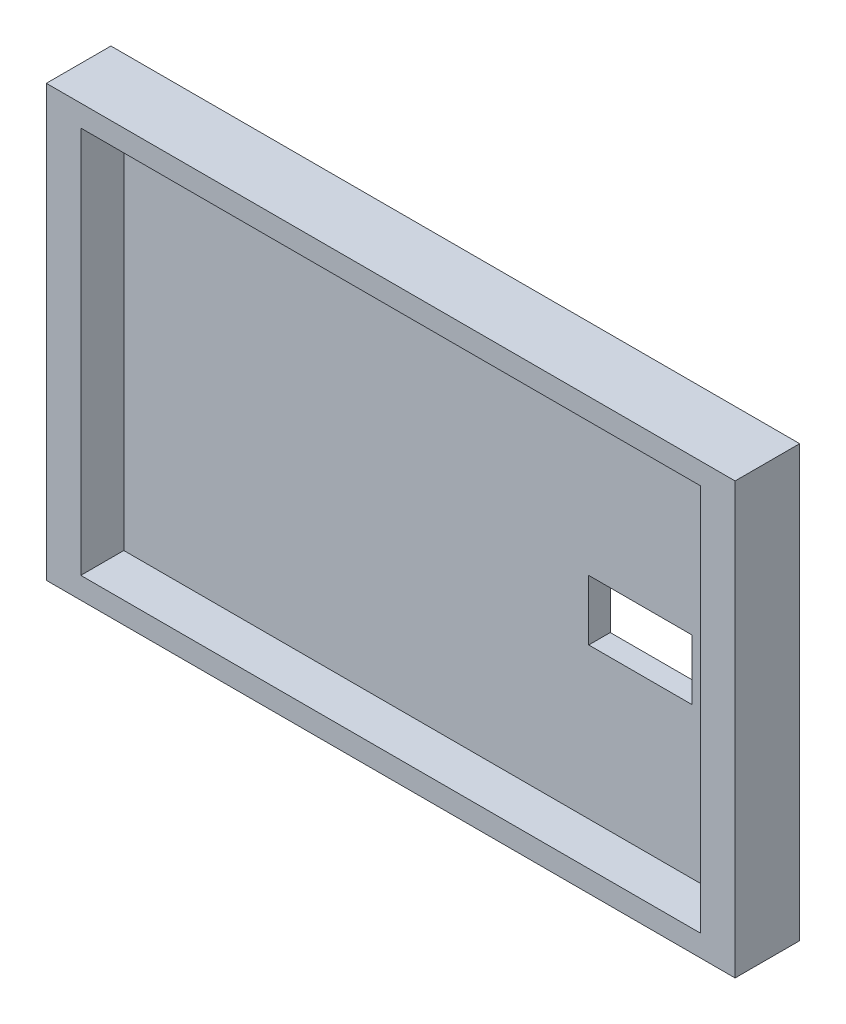
ISO-10303-21;
HEADER;
FILE_DESCRIPTION(('STEP AP214'),'2;1');
FILE_NAME('part.step','',(''),(''),'','','');
FILE_SCHEMA(('AUTOMOTIVE_DESIGN { 1 0 10303 214 1 1 1 1 }'));
ENDSEC;
DATA;
#1=APPLICATION_CONTEXT('core data for automotive mechanical design processes');
#2=APPLICATION_PROTOCOL_DEFINITION('international standard','automotive_design',2000,#1);
#3=PRODUCT_CONTEXT('',#1,'mechanical');
#4=PRODUCT('Part','Part','',(#3));
#5=PRODUCT_RELATED_PRODUCT_CATEGORY('part','',(#4));
#6=PRODUCT_DEFINITION_FORMATION('','',#4);
#7=PRODUCT_DEFINITION_CONTEXT('part definition',#1,'design');
#8=PRODUCT_DEFINITION('design','',#6,#7);
#9=PRODUCT_DEFINITION_SHAPE('','',#8);
#10=(LENGTH_UNIT() NAMED_UNIT(*) SI_UNIT(.MILLI.,.METRE.));
#11=(NAMED_UNIT(*) PLANE_ANGLE_UNIT() SI_UNIT($,.RADIAN.));
#12=(NAMED_UNIT(*) SI_UNIT($,.STERADIAN.) SOLID_ANGLE_UNIT());
#13=UNCERTAINTY_MEASURE_WITH_UNIT(LENGTH_MEASURE(1.E-05),#10,'distance_accuracy_value','');
#14=(GEOMETRIC_REPRESENTATION_CONTEXT(3) GLOBAL_UNCERTAINTY_ASSIGNED_CONTEXT((#13)) GLOBAL_UNIT_ASSIGNED_CONTEXT((#10,
#11,#12)) REPRESENTATION_CONTEXT('',''));
#15=CARTESIAN_POINT('',(0.,0.,0.));
#16=DIRECTION('',(0.,0.,1.));
#17=DIRECTION('',(1.,0.,0.));
#18=AXIS2_PLACEMENT_3D('',#15,#16,#17);
#19=CARTESIAN_POINT('',(0.,0.,0.));
#20=DIRECTION('',(0.,0.,1.));
#21=DIRECTION('',(1.,0.,0.));
#22=AXIS2_PLACEMENT_3D('',#19,#20,#21);
#23=PLANE('',#22);
#24=DIRECTION('',(0.,1.,0.));
#25=VECTOR('',#24,1.);
#26=CARTESIAN_POINT('',(80.,50.,0.));
#27=LINE('',#26,#25);
#28=CARTESIAN_POINT('',(80.,-50.,0.));
#29=VERTEX_POINT('',#28);
#30=CARTESIAN_POINT('',(80.,50.,0.));
#31=VERTEX_POINT('',#30);
#32=EDGE_CURVE('E209',#29,#31,#27,.T.);
#33=ORIENTED_EDGE('',*,*,#32,.F.);
#34=DIRECTION('',(1.,0.,0.));
#35=VECTOR('',#34,1.);
#36=CARTESIAN_POINT('',(-80.,-50.,0.));
#37=LINE('',#36,#35);
#38=CARTESIAN_POINT('',(-80.,-50.,0.));
#39=VERTEX_POINT('',#38);
#40=EDGE_CURVE('E215',#39,#29,#37,.T.);
#41=ORIENTED_EDGE('',*,*,#40,.F.);
#42=DIRECTION('',(0.,-1.,0.));
#43=VECTOR('',#42,1.);
#44=CARTESIAN_POINT('',(-80.,50.,0.));
#45=LINE('',#44,#43);
#46=CARTESIAN_POINT('',(-80.,50.,0.));
#47=VERTEX_POINT('',#46);
#48=EDGE_CURVE('E231',#47,#39,#45,.T.);
#49=ORIENTED_EDGE('',*,*,#48,.F.);
#50=DIRECTION('',(-1.,0.,0.));
#51=VECTOR('',#50,1.);
#52=CARTESIAN_POINT('',(-80.,50.,0.));
#53=LINE('',#52,#51);
#54=EDGE_CURVE('E228',#31,#47,#53,.T.);
#55=ORIENTED_EDGE('',*,*,#54,.F.);
#56=EDGE_LOOP('',(#33,#41,#49,#55));
#57=FACE_BOUND('',#56,.T.);
#58=DIRECTION('',(0.,1.,0.));
#59=VECTOR('',#58,1.);
#60=CARTESIAN_POINT('',(60.,3.99999999999998,0.));
#61=LINE('',#60,#59);
#62=CARTESIAN_POINT('',(60.,-10.,0.));
#63=VERTEX_POINT('',#62);
#64=CARTESIAN_POINT('',(60.,3.99999999999998,0.));
#65=VERTEX_POINT('',#64);
#66=EDGE_CURVE('E61',#63,#65,#61,.T.);
#67=ORIENTED_EDGE('',*,*,#66,.T.);
#68=DIRECTION('',(-1.,0.,0.));
#69=VECTOR('',#68,1.);
#70=CARTESIAN_POINT('',(36.,3.99999999999998,0.));
#71=LINE('',#70,#69);
#72=CARTESIAN_POINT('',(36.,3.99999999999998,0.));
#73=VERTEX_POINT('',#72);
#74=EDGE_CURVE('E144',#65,#73,#71,.T.);
#75=ORIENTED_EDGE('',*,*,#74,.T.);
#76=DIRECTION('',(0.,-1.,0.));
#77=VECTOR('',#76,1.);
#78=CARTESIAN_POINT('',(36.,3.99999999999998,0.));
#79=LINE('',#78,#77);
#80=CARTESIAN_POINT('',(36.,-10.,0.));
#81=VERTEX_POINT('',#80);
#82=EDGE_CURVE('E151',#73,#81,#79,.T.);
#83=ORIENTED_EDGE('',*,*,#82,.T.);
#84=DIRECTION('',(1.,0.,0.));
#85=VECTOR('',#84,1.);
#86=CARTESIAN_POINT('',(36.,-10.,0.));
#87=LINE('',#86,#85);
#88=EDGE_CURVE('E154',#81,#63,#87,.T.);
#89=ORIENTED_EDGE('',*,*,#88,.T.);
#90=EDGE_LOOP('',(#67,#75,#83,#89));
#91=FACE_BOUND('',#90,.T.);
#92=ADVANCED_FACE('F45',(#57,#91),#23,.F.);
#93=CARTESIAN_POINT('',(0.,0.,5.));
#94=DIRECTION('',(0.,0.,-1.));
#95=DIRECTION('',(-1.,0.,0.));
#96=AXIS2_PLACEMENT_3D('',#93,#94,#95);
#97=PLANE('',#96);
#98=DIRECTION('',(0.,-1.,0.));
#99=VECTOR('',#98,1.);
#100=CARTESIAN_POINT('',(-72.,45.,5.));
#101=LINE('',#100,#99);
#102=CARTESIAN_POINT('',(-72.,45.,5.));
#103=VERTEX_POINT('',#102);
#104=CARTESIAN_POINT('',(-72.,-45.,5.));
#105=VERTEX_POINT('',#104);
#106=EDGE_CURVE('E140',#103,#105,#101,.T.);
#107=ORIENTED_EDGE('',*,*,#106,.T.);
#108=DIRECTION('',(1.,0.,0.));
#109=VECTOR('',#108,1.);
#110=CARTESIAN_POINT('',(72.,-45.,5.));
#111=LINE('',#110,#109);
#112=CARTESIAN_POINT('',(72.,-45.,5.));
#113=VERTEX_POINT('',#112);
#114=EDGE_CURVE('E171',#105,#113,#111,.T.);
#115=ORIENTED_EDGE('',*,*,#114,.T.);
#116=DIRECTION('',(0.,1.,0.));
#117=VECTOR('',#116,1.);
#118=CARTESIAN_POINT('',(72.,45.,5.));
#119=LINE('',#118,#117);
#120=CARTESIAN_POINT('',(72.,45.,5.));
#121=VERTEX_POINT('',#120);
#122=EDGE_CURVE('E174',#113,#121,#119,.T.);
#123=ORIENTED_EDGE('',*,*,#122,.T.);
#124=DIRECTION('',(-1.,0.,0.));
#125=VECTOR('',#124,1.);
#126=CARTESIAN_POINT('',(72.,45.,5.));
#127=LINE('',#126,#125);
#128=EDGE_CURVE('E177',#121,#103,#127,.T.);
#129=ORIENTED_EDGE('',*,*,#128,.T.);
#130=EDGE_LOOP('',(#107,#115,#123,#129));
#131=FACE_BOUND('',#130,.T.);
#132=DIRECTION('',(0.,1.,0.));
#133=VECTOR('',#132,1.);
#134=CARTESIAN_POINT('',(60.,0.,5.));
#135=LINE('',#134,#133);
#136=CARTESIAN_POINT('',(60.,-10.,5.));
#137=VERTEX_POINT('',#136);
#138=CARTESIAN_POINT('',(60.,3.99999999999998,5.));
#139=VERTEX_POINT('',#138);
#140=EDGE_CURVE('E11',#137,#139,#135,.T.);
#141=ORIENTED_EDGE('',*,*,#140,.F.);
#142=DIRECTION('',(1.,0.,0.));
#143=VECTOR('',#142,1.);
#144=CARTESIAN_POINT('',(0.,-10.,5.));
#145=LINE('',#144,#143);
#146=CARTESIAN_POINT('',(36.,-10.,5.));
#147=VERTEX_POINT('',#146);
#148=EDGE_CURVE('E251',#147,#137,#145,.T.);
#149=ORIENTED_EDGE('',*,*,#148,.F.);
#150=DIRECTION('',(0.,-1.,0.));
#151=VECTOR('',#150,1.);
#152=CARTESIAN_POINT('',(36.,0.,5.));
#153=LINE('',#152,#151);
#154=CARTESIAN_POINT('',(36.,3.99999999999998,5.));
#155=VERTEX_POINT('',#154);
#156=EDGE_CURVE('E254',#155,#147,#153,.T.);
#157=ORIENTED_EDGE('',*,*,#156,.F.);
#158=DIRECTION('',(-1.,0.,0.));
#159=VECTOR('',#158,1.);
#160=CARTESIAN_POINT('',(0.,3.99999999999998,5.));
#161=LINE('',#160,#159);
#162=EDGE_CURVE('E54',#139,#155,#161,.T.);
#163=ORIENTED_EDGE('',*,*,#162,.F.);
#164=EDGE_LOOP('',(#141,#149,#157,#163));
#165=FACE_BOUND('',#164,.T.);
#166=ADVANCED_FACE('F262',(#131,#165),#97,.F.);
#167=CARTESIAN_POINT('',(-72.,45.,15.));
#168=DIRECTION('',(1.,0.,0.));
#169=DIRECTION('',(0.,1.,0.));
#170=AXIS2_PLACEMENT_3D('',#167,#168,#169);
#171=PLANE('',#170);
#172=DIRECTION('',(0.,0.,-1.));
#173=VECTOR('',#172,1.);
#174=CARTESIAN_POINT('',(-72.,-45.,15.));
#175=LINE('',#174,#173);
#176=CARTESIAN_POINT('',(-72.,-45.,15.));
#177=VERTEX_POINT('',#176);
#178=EDGE_CURVE('E205',#177,#105,#175,.T.);
#179=ORIENTED_EDGE('',*,*,#178,.T.);
#180=ORIENTED_EDGE('',*,*,#106,.F.);
#181=DIRECTION('',(0.,0.,-1.));
#182=VECTOR('',#181,1.);
#183=CARTESIAN_POINT('',(-72.,45.,15.));
#184=LINE('',#183,#182);
#185=CARTESIAN_POINT('',(-72.,45.,15.));
#186=VERTEX_POINT('',#185);
#187=EDGE_CURVE('E193',#186,#103,#184,.T.);
#188=ORIENTED_EDGE('',*,*,#187,.F.);
#189=DIRECTION('',(0.,-1.,0.));
#190=VECTOR('',#189,1.);
#191=CARTESIAN_POINT('',(-72.,45.,15.));
#192=LINE('',#191,#190);
#193=EDGE_CURVE('E180',#186,#177,#192,.T.);
#194=ORIENTED_EDGE('',*,*,#193,.T.);
#195=EDGE_LOOP('',(#179,#180,#188,#194));
#196=FACE_BOUND('',#195,.T.);
#197=ADVANCED_FACE('F277',(#196),#171,.T.);
#198=CARTESIAN_POINT('',(72.,-45.,15.));
#199=DIRECTION('',(0.,1.,0.));
#200=DIRECTION('',(-1.,0.,0.));
#201=AXIS2_PLACEMENT_3D('',#198,#199,#200);
#202=PLANE('',#201);
#203=DIRECTION('',(0.,0.,-1.));
#204=VECTOR('',#203,1.);
#205=CARTESIAN_POINT('',(72.,-45.,15.));
#206=LINE('',#205,#204);
#207=CARTESIAN_POINT('',(72.,-45.,15.));
#208=VERTEX_POINT('',#207);
#209=EDGE_CURVE('E201',#208,#113,#206,.T.);
#210=ORIENTED_EDGE('',*,*,#209,.T.);
#211=ORIENTED_EDGE('',*,*,#114,.F.);
#212=ORIENTED_EDGE('',*,*,#178,.F.);
#213=DIRECTION('',(1.,0.,0.));
#214=VECTOR('',#213,1.);
#215=CARTESIAN_POINT('',(72.,-45.,15.));
#216=LINE('',#215,#214);
#217=EDGE_CURVE('E183',#177,#208,#216,.T.);
#218=ORIENTED_EDGE('',*,*,#217,.T.);
#219=EDGE_LOOP('',(#210,#211,#212,#218));
#220=FACE_BOUND('',#219,.T.);
#221=ADVANCED_FACE('F319',(#220),#202,.T.);
#222=CARTESIAN_POINT('',(72.,45.,15.));
#223=DIRECTION('',(-1.,0.,0.));
#224=DIRECTION('',(0.,-1.,0.));
#225=AXIS2_PLACEMENT_3D('',#222,#223,#224);
#226=PLANE('',#225);
#227=DIRECTION('',(0.,0.,-1.));
#228=VECTOR('',#227,1.);
#229=CARTESIAN_POINT('',(72.,45.,15.));
#230=LINE('',#229,#228);
#231=CARTESIAN_POINT('',(72.,45.,15.));
#232=VERTEX_POINT('',#231);
#233=EDGE_CURVE('E197',#232,#121,#230,.T.);
#234=ORIENTED_EDGE('',*,*,#233,.T.);
#235=ORIENTED_EDGE('',*,*,#122,.F.);
#236=ORIENTED_EDGE('',*,*,#209,.F.);
#237=DIRECTION('',(0.,1.,0.));
#238=VECTOR('',#237,1.);
#239=CARTESIAN_POINT('',(72.,45.,15.));
#240=LINE('',#239,#238);
#241=EDGE_CURVE('E186',#208,#232,#240,.T.);
#242=ORIENTED_EDGE('',*,*,#241,.T.);
#243=EDGE_LOOP('',(#234,#235,#236,#242));
#244=FACE_BOUND('',#243,.T.);
#245=ADVANCED_FACE('F323',(#244),#226,.T.);
#246=CARTESIAN_POINT('',(72.,45.,15.));
#247=DIRECTION('',(0.,-1.,0.));
#248=DIRECTION('',(1.,0.,0.));
#249=AXIS2_PLACEMENT_3D('',#246,#247,#248);
#250=PLANE('',#249);
#251=ORIENTED_EDGE('',*,*,#187,.T.);
#252=ORIENTED_EDGE('',*,*,#128,.F.);
#253=ORIENTED_EDGE('',*,*,#233,.F.);
#254=DIRECTION('',(-1.,0.,0.));
#255=VECTOR('',#254,1.);
#256=CARTESIAN_POINT('',(72.,45.,15.));
#257=LINE('',#256,#255);
#258=EDGE_CURVE('E190',#232,#186,#257,.T.);
#259=ORIENTED_EDGE('',*,*,#258,.T.);
#260=EDGE_LOOP('',(#251,#252,#253,#259));
#261=FACE_BOUND('',#260,.T.);
#262=ADVANCED_FACE('F311',(#261),#250,.T.);
#263=CARTESIAN_POINT('',(0.,0.,15.));
#264=DIRECTION('',(0.,0.,1.));
#265=DIRECTION('',(1.,0.,0.));
#266=AXIS2_PLACEMENT_3D('',#263,#264,#265);
#267=PLANE('',#266);
#268=DIRECTION('',(0.,1.,0.));
#269=VECTOR('',#268,1.);
#270=CARTESIAN_POINT('',(80.,50.,15.));
#271=LINE('',#270,#269);
#272=CARTESIAN_POINT('',(80.,-50.,15.));
#273=VERTEX_POINT('',#272);
#274=CARTESIAN_POINT('',(80.,50.,15.));
#275=VERTEX_POINT('',#274);
#276=EDGE_CURVE('E210',#273,#275,#271,.T.);
#277=ORIENTED_EDGE('',*,*,#276,.T.);
#278=DIRECTION('',(-1.,0.,0.));
#279=VECTOR('',#278,1.);
#280=CARTESIAN_POINT('',(-80.,50.,15.));
#281=LINE('',#280,#279);
#282=CARTESIAN_POINT('',(-80.,50.,15.));
#283=VERTEX_POINT('',#282);
#284=EDGE_CURVE('E214',#275,#283,#281,.T.);
#285=ORIENTED_EDGE('',*,*,#284,.T.);
#286=DIRECTION('',(0.,-1.,0.));
#287=VECTOR('',#286,1.);
#288=CARTESIAN_POINT('',(-80.,50.,15.));
#289=LINE('',#288,#287);
#290=CARTESIAN_POINT('',(-80.,-50.,15.));
#291=VERTEX_POINT('',#290);
#292=EDGE_CURVE('E218',#283,#291,#289,.T.);
#293=ORIENTED_EDGE('',*,*,#292,.T.);
#294=DIRECTION('',(1.,0.,0.));
#295=VECTOR('',#294,1.);
#296=CARTESIAN_POINT('',(-80.,-50.,15.));
#297=LINE('',#296,#295);
#298=EDGE_CURVE('E221',#291,#273,#297,.T.);
#299=ORIENTED_EDGE('',*,*,#298,.T.);
#300=EDGE_LOOP('',(#277,#285,#293,#299));
#301=FACE_BOUND('',#300,.T.);
#302=ORIENTED_EDGE('',*,*,#217,.F.);
#303=ORIENTED_EDGE('',*,*,#193,.F.);
#304=ORIENTED_EDGE('',*,*,#258,.F.);
#305=ORIENTED_EDGE('',*,*,#241,.F.);
#306=EDGE_LOOP('',(#302,#303,#304,#305));
#307=FACE_BOUND('',#306,.T.);
#308=ADVANCED_FACE('F283',(#301,#307),#267,.T.);
#309=CARTESIAN_POINT('',(80.,50.,15.));
#310=DIRECTION('',(-1.,0.,0.));
#311=DIRECTION('',(0.,0.,1.));
#312=AXIS2_PLACEMENT_3D('',#309,#310,#311);
#313=PLANE('',#312);
#314=ORIENTED_EDGE('',*,*,#32,.T.);
#315=DIRECTION('',(0.,0.,-1.));
#316=VECTOR('',#315,1.);
#317=CARTESIAN_POINT('',(80.,50.,15.));
#318=LINE('',#317,#316);
#319=EDGE_CURVE('E247',#275,#31,#318,.T.);
#320=ORIENTED_EDGE('',*,*,#319,.F.);
#321=ORIENTED_EDGE('',*,*,#276,.F.);
#322=DIRECTION('',(0.,0.,-1.));
#323=VECTOR('',#322,1.);
#324=CARTESIAN_POINT('',(80.,-50.,15.));
#325=LINE('',#324,#323);
#326=EDGE_CURVE('E224',#273,#29,#325,.T.);
#327=ORIENTED_EDGE('',*,*,#326,.T.);
#328=EDGE_LOOP('',(#314,#320,#321,#327));
#329=FACE_BOUND('',#328,.T.);
#330=ADVANCED_FACE('F47',(#329),#313,.F.);
#331=CARTESIAN_POINT('',(-80.,50.,15.));
#332=DIRECTION('',(0.,-1.,0.));
#333=DIRECTION('',(0.,0.,-1.));
#334=AXIS2_PLACEMENT_3D('',#331,#332,#333);
#335=PLANE('',#334);
#336=ORIENTED_EDGE('',*,*,#54,.T.);
#337=DIRECTION('',(0.,0.,-1.));
#338=VECTOR('',#337,1.);
#339=CARTESIAN_POINT('',(-80.,50.,15.));
#340=LINE('',#339,#338);
#341=EDGE_CURVE('E243',#283,#47,#340,.T.);
#342=ORIENTED_EDGE('',*,*,#341,.F.);
#343=ORIENTED_EDGE('',*,*,#284,.F.);
#344=ORIENTED_EDGE('',*,*,#319,.T.);
#345=EDGE_LOOP('',(#336,#342,#343,#344));
#346=FACE_BOUND('',#345,.T.);
#347=ADVANCED_FACE('F291',(#346),#335,.F.);
#348=CARTESIAN_POINT('',(-80.,50.,15.));
#349=DIRECTION('',(1.,0.,0.));
#350=DIRECTION('',(0.,0.,-1.));
#351=AXIS2_PLACEMENT_3D('',#348,#349,#350);
#352=PLANE('',#351);
#353=ORIENTED_EDGE('',*,*,#48,.T.);
#354=DIRECTION('',(0.,0.,-1.));
#355=VECTOR('',#354,1.);
#356=CARTESIAN_POINT('',(-80.,-50.,15.));
#357=LINE('',#356,#355);
#358=EDGE_CURVE('E239',#291,#39,#357,.T.);
#359=ORIENTED_EDGE('',*,*,#358,.F.);
#360=ORIENTED_EDGE('',*,*,#292,.F.);
#361=ORIENTED_EDGE('',*,*,#341,.T.);
#362=EDGE_LOOP('',(#353,#359,#360,#361));
#363=FACE_BOUND('',#362,.T.);
#364=ADVANCED_FACE('F288',(#363),#352,.F.);
#365=CARTESIAN_POINT('',(-80.,-50.,15.));
#366=DIRECTION('',(0.,1.,0.));
#367=DIRECTION('',(0.,0.,1.));
#368=AXIS2_PLACEMENT_3D('',#365,#366,#367);
#369=PLANE('',#368);
#370=ORIENTED_EDGE('',*,*,#40,.T.);
#371=ORIENTED_EDGE('',*,*,#326,.F.);
#372=ORIENTED_EDGE('',*,*,#298,.F.);
#373=ORIENTED_EDGE('',*,*,#358,.T.);
#374=EDGE_LOOP('',(#370,#371,#372,#373));
#375=FACE_BOUND('',#374,.T.);
#376=ADVANCED_FACE('F285',(#375),#369,.F.);
#377=CARTESIAN_POINT('',(60.,3.99999999999998,21.));
#378=DIRECTION('',(-1.,0.,0.));
#379=DIRECTION('',(0.,0.,1.));
#380=AXIS2_PLACEMENT_3D('',#377,#378,#379);
#381=PLANE('',#380);
#382=ORIENTED_EDGE('',*,*,#140,.T.);
#383=DIRECTION('',(0.,0.,-1.));
#384=VECTOR('',#383,1.);
#385=CARTESIAN_POINT('',(60.,3.99999999999998,21.));
#386=LINE('',#385,#384);
#387=EDGE_CURVE('E133',#139,#65,#386,.T.);
#388=ORIENTED_EDGE('',*,*,#387,.T.);
#389=ORIENTED_EDGE('',*,*,#66,.F.);
#390=DIRECTION('',(0.,0.,-1.));
#391=VECTOR('',#390,1.);
#392=CARTESIAN_POINT('',(60.,-10.,21.));
#393=LINE('',#392,#391);
#394=EDGE_CURVE('E162',#137,#63,#393,.T.);
#395=ORIENTED_EDGE('',*,*,#394,.F.);
#396=EDGE_LOOP('',(#382,#388,#389,#395));
#397=FACE_BOUND('',#396,.T.);
#398=ADVANCED_FACE('F135',(#397),#381,.T.);
#399=CARTESIAN_POINT('',(36.,3.99999999999998,21.));
#400=DIRECTION('',(0.,-1.,0.));
#401=DIRECTION('',(0.,0.,-1.));
#402=AXIS2_PLACEMENT_3D('',#399,#400,#401);
#403=PLANE('',#402);
#404=ORIENTED_EDGE('',*,*,#162,.T.);
#405=DIRECTION('',(0.,0.,-1.));
#406=VECTOR('',#405,1.);
#407=CARTESIAN_POINT('',(36.,3.99999999999998,21.));
#408=LINE('',#407,#406);
#409=EDGE_CURVE('E141',#155,#73,#408,.T.);
#410=ORIENTED_EDGE('',*,*,#409,.T.);
#411=ORIENTED_EDGE('',*,*,#74,.F.);
#412=ORIENTED_EDGE('',*,*,#387,.F.);
#413=EDGE_LOOP('',(#404,#410,#411,#412));
#414=FACE_BOUND('',#413,.T.);
#415=ADVANCED_FACE('F145',(#414),#403,.T.);
#416=CARTESIAN_POINT('',(36.,3.99999999999998,21.));
#417=DIRECTION('',(1.,0.,0.));
#418=DIRECTION('',(0.,0.,-1.));
#419=AXIS2_PLACEMENT_3D('',#416,#417,#418);
#420=PLANE('',#419);
#421=ORIENTED_EDGE('',*,*,#156,.T.);
#422=DIRECTION('',(0.,0.,-1.));
#423=VECTOR('',#422,1.);
#424=CARTESIAN_POINT('',(36.,-10.,21.));
#425=LINE('',#424,#423);
#426=EDGE_CURVE('E69',#147,#81,#425,.T.);
#427=ORIENTED_EDGE('',*,*,#426,.T.);
#428=ORIENTED_EDGE('',*,*,#82,.F.);
#429=ORIENTED_EDGE('',*,*,#409,.F.);
#430=EDGE_LOOP('',(#421,#427,#428,#429));
#431=FACE_BOUND('',#430,.T.);
#432=ADVANCED_FACE('F260',(#431),#420,.T.);
#433=CARTESIAN_POINT('',(36.,-10.,21.));
#434=DIRECTION('',(0.,1.,0.));
#435=DIRECTION('',(-1.,0.,0.));
#436=AXIS2_PLACEMENT_3D('',#433,#434,#435);
#437=PLANE('',#436);
#438=ORIENTED_EDGE('',*,*,#148,.T.);
#439=ORIENTED_EDGE('',*,*,#394,.T.);
#440=ORIENTED_EDGE('',*,*,#88,.F.);
#441=ORIENTED_EDGE('',*,*,#426,.F.);
#442=EDGE_LOOP('',(#438,#439,#440,#441));
#443=FACE_BOUND('',#442,.T.);
#444=ADVANCED_FACE('F263',(#443),#437,.T.);
#445=CLOSED_SHELL('',(#92,#166,#197,#221,#245,#262,#308,#330,#347,#364,#376,#398,#415,#432,#444));
#446=MANIFOLD_SOLID_BREP('B2',#445);
#447=ADVANCED_BREP_SHAPE_REPRESENTATION('',(#18,#446),#14);
#448=SHAPE_DEFINITION_REPRESENTATION(#9,#447);
ENDSEC;
END-ISO-10303-21;
